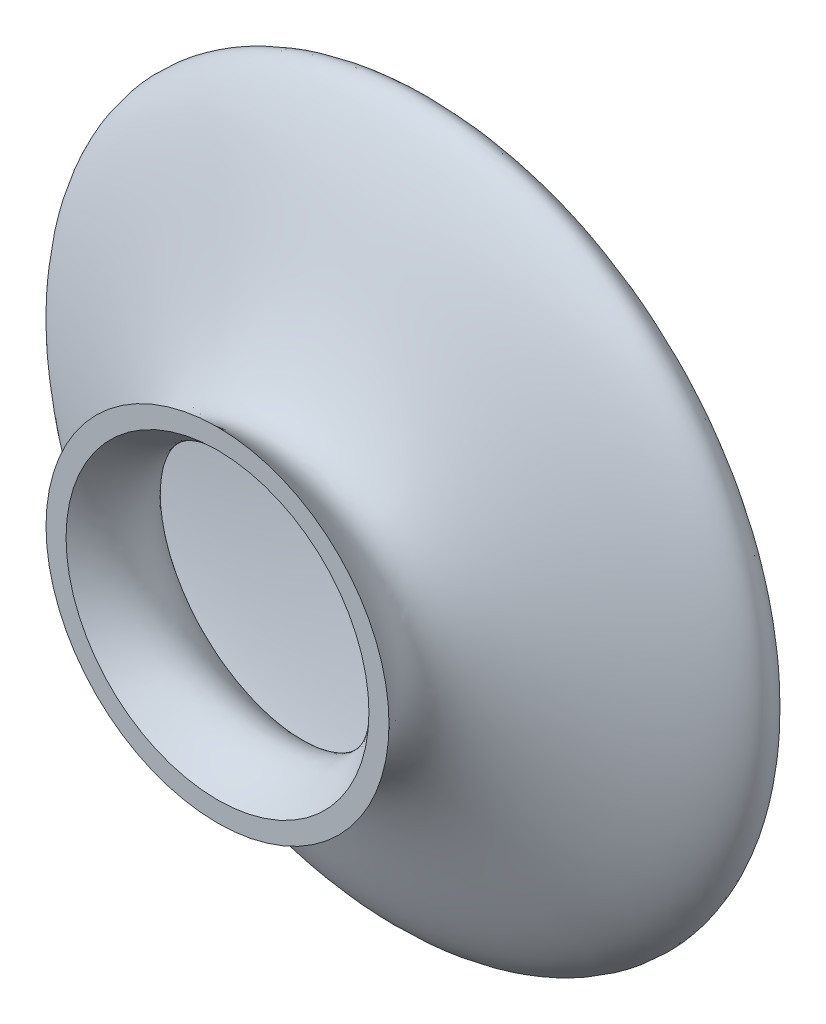
ISO-10303-21;
HEADER;
FILE_DESCRIPTION(('STEP AP214'),'2;1');
FILE_NAME('part.step','',(''),(''),'','','');
FILE_SCHEMA(('AUTOMOTIVE_DESIGN { 1 0 10303 214 1 1 1 1 }'));
ENDSEC;
DATA;
#1=APPLICATION_CONTEXT('core data for automotive mechanical design processes');
#2=APPLICATION_PROTOCOL_DEFINITION('international standard','automotive_design',2000,#1);
#3=PRODUCT_CONTEXT('',#1,'mechanical');
#4=PRODUCT('Part','Part','',(#3));
#5=PRODUCT_RELATED_PRODUCT_CATEGORY('part','',(#4));
#6=PRODUCT_DEFINITION_FORMATION('','',#4);
#7=PRODUCT_DEFINITION_CONTEXT('part definition',#1,'design');
#8=PRODUCT_DEFINITION('design','',#6,#7);
#9=PRODUCT_DEFINITION_SHAPE('','',#8);
#10=(LENGTH_UNIT() NAMED_UNIT(*) SI_UNIT(.MILLI.,.METRE.));
#11=(NAMED_UNIT(*) PLANE_ANGLE_UNIT() SI_UNIT($,.RADIAN.));
#12=(NAMED_UNIT(*) SI_UNIT($,.STERADIAN.) SOLID_ANGLE_UNIT());
#13=UNCERTAINTY_MEASURE_WITH_UNIT(LENGTH_MEASURE(1.E-05),#10,'distance_accuracy_value','');
#14=(GEOMETRIC_REPRESENTATION_CONTEXT(3) GLOBAL_UNCERTAINTY_ASSIGNED_CONTEXT((#13)) GLOBAL_UNIT_ASSIGNED_CONTEXT((#10,
#11,#12)) REPRESENTATION_CONTEXT('',''));
#15=CARTESIAN_POINT('',(0.,0.,0.));
#16=DIRECTION('',(0.,0.,1.));
#17=DIRECTION('',(1.,0.,0.));
#18=AXIS2_PLACEMENT_3D('',#15,#16,#17);
#19=CARTESIAN_POINT('',(0.,40.1749024461703,-127.));
#20=CARTESIAN_POINT('',(0.,41.4414019211106,-126.750604813559));
#21=CARTESIAN_POINT('',(0.,44.0461469543306,-126.236821262521));
#22=CARTESIAN_POINT('',(0.,50.6007651177522,-124.940007316391));
#23=CARTESIAN_POINT('',(0.,59.2534667352402,-123.208199153359));
#24=CARTESIAN_POINT('',(0.,69.549203917735,-121.107831932044));
#25=CARTESIAN_POINT('',(0.,81.2804931493034,-118.631164571267));
#26=CARTESIAN_POINT('',(0.,92.974339805805,-116.04372231612));
#27=CARTESIAN_POINT('',(0.,103.187830037622,-113.638494879811));
#28=CARTESIAN_POINT('',(0.,111.899086195115,-111.438757455287));
#29=CARTESIAN_POINT('',(0.,119.130970308662,-109.478566403329));
#30=CARTESIAN_POINT('',(0.,124.887113287129,-107.817607666161));
#31=CARTESIAN_POINT('',(0.,130.348260360398,-106.120426963924));
#32=CARTESIAN_POINT('',(0.,135.503413055523,-104.37536398544));
#33=CARTESIAN_POINT('',(0.,140.345698031985,-102.567404060437));
#34=CARTESIAN_POINT('',(0.,144.860961033631,-100.679411935521));
#35=CARTESIAN_POINT('',(0.,149.013238591044,-98.6725808415814));
#36=CARTESIAN_POINT('',(0.,152.35049949,-96.7316735182867));
#37=CARTESIAN_POINT('',(0.,154.873873341389,-94.9195395213734));
#38=CARTESIAN_POINT('',(0.,156.924745488784,-93.0877146772521));
#39=CARTESIAN_POINT('',(0.,158.295776639094,-91.4827635344511));
#40=CARTESIAN_POINT('',(0.,159.252299625908,-89.7732636786435));
#41=CARTESIAN_POINT('',(0.,159.736253810502,-87.8592681549841));
#42=CARTESIAN_POINT('',(0.,159.786660469074,-86.0844807006875));
#43=CARTESIAN_POINT('',(0.,159.235545279379,-84.100199392072));
#44=CARTESIAN_POINT('',(0.,158.070854838249,-82.1097331396155));
#45=CARTESIAN_POINT('',(0.,156.490016667143,-80.2218440880137));
#46=CARTESIAN_POINT('',(0.,154.695602783555,-78.5261683652711));
#47=CARTESIAN_POINT('',(0.,152.164404510104,-76.5037296586083));
#48=CARTESIAN_POINT('',(0.,149.385593587913,-74.6389666095655));
#49=CARTESIAN_POINT('',(0.,146.5166658544,-72.9185517352579));
#50=CARTESIAN_POINT('',(0.,143.584038254754,-71.3055334151804));
#51=CARTESIAN_POINT('',(0.,141.20822667765,-70.0653863891528));
#52=CARTESIAN_POINT('',(0.,138.210817827935,-68.5689572008392));
#53=CARTESIAN_POINT('',(0.,134.579838967493,-66.8433159167663));
#54=CARTESIAN_POINT('',(0.,130.308342210159,-64.9062203841946));
#55=CARTESIAN_POINT('',(0.,125.395635431771,-62.7625626108));
#56=CARTESIAN_POINT('',(0.,120.463919063654,-60.6631460210674));
#57=CARTESIAN_POINT('',(0.,115.522613748881,-58.5865110351406));
#58=CARTESIAN_POINT('',(0.,110.579691349829,-56.5137495892166));
#59=CARTESIAN_POINT('',(0.,105.642718006137,-54.4267763548241));
#60=CARTESIAN_POINT('',(0.,100.719657493353,-52.3071530829638));
#61=CARTESIAN_POINT('',(0.,95.8195855374675,-50.1345768514087));
#62=CARTESIAN_POINT('',(0.,91.090722367048,-47.9486064898861));
#63=CARTESIAN_POINT('',(0.,86.5438567318524,-45.7294453835949));
#64=CARTESIAN_POINT('',(0.,82.193101497207,-43.4557871452477));
#65=CARTESIAN_POINT('',(0.,78.0556726962069,-41.1032395462933));
#66=CARTESIAN_POINT('',(0.,74.0989263458421,-38.5916748028364));
#67=CARTESIAN_POINT('',(0.,70.3770107676925,-35.8605911601953));
#68=CARTESIAN_POINT('',(0.,67.357804950721,-33.1569889757805));
#69=CARTESIAN_POINT('',(0.,65.0655195392958,-30.5225820990703));
#70=CARTESIAN_POINT('',(0.,63.300806121086,-27.7355173102646));
#71=CARTESIAN_POINT('',(0.,62.2683351867874,-25.1919312821399));
#72=CARTESIAN_POINT('',(0.,61.8420741781314,-22.5472037978377));
#73=CARTESIAN_POINT('',(0.,62.0320574400823,-19.7008978775976));
#74=CARTESIAN_POINT('',(0.,62.733852077571,-17.0529703637298));
#75=CARTESIAN_POINT('',(0.,64.1002931291334,-14.087960980921));
#76=CARTESIAN_POINT('',(0.,65.8760803006642,-11.3675849536212));
#77=CARTESIAN_POINT('',(0.,67.5348624468086,-9.23724869416343));
#78=CARTESIAN_POINT('',(0.,68.9335408027901,-7.59534567279619));
#79=CARTESIAN_POINT('',(0.,69.8287383509904,-6.58761499282965));
#80=CARTESIAN_POINT('',(0.,70.5546454436049,-5.79172106884749));
#81=CARTESIAN_POINT('',(0.,71.2969783895233,-4.99678810992577));
#82=CARTESIAN_POINT('',(0.,72.0122796615693,-4.24342724512397));
#83=CARTESIAN_POINT('',(0.,73.0350535432262,-3.18812102771738));
#84=CARTESIAN_POINT('',(0.,73.9568237843356,-2.24660085762518));
#85=CARTESIAN_POINT('',(0.,75.2128453362792,-0.987154507986555));
#86=CARTESIAN_POINT('',(0.,75.8714966061481,-0.328503393851881));
#87=CARTESIAN_POINT('',(0.,76.2,0.));
#88=B_SPLINE_CURVE_WITH_KNOTS('',4,(#19,#20,#21,#22,#23,#24,#25,#26,#27,#28,#29,#30,#31,#32,#33,
#34,#35,#36,#37,#38,#39,#40,#41,#42,#43,#44,#45,#46,#47,#48,#49,#50,#51,#52,#53,#54,#55,#56,#57,
#58,#59,#60,#61,#62,#63,#64,#65,#66,#67,#68,#69,#70,#71,#72,#73,#74,#75,#76,#77,#78,#79,#80,#81,
#82,#83,#84,#85,#86,#87),.UNSPECIFIED.,.F.,.F.,(5,1,1,1,1,1,1,1,1,1,1,1,1,1,1,1,1,1,1,1,1,1,1,1,
1,1,1,1,1,1,1,1,1,1,1,1,1,1,1,1,1,1,1,1,1,1,1,1,1,1,1,1,1,1,1,1,1,1,1,1,1,1,1,1,1,5),
(0.0525184973487657,0.0711068419678162,0.089695186278309,0.126871874899295,0.164048560830599,
0.201225246761903,0.238401829003599,0.275578411245294,0.294166807736091,0.312755204226887,
0.331343600717684,0.349931997208481,0.365109531415269,0.380287065622058,0.395464599828847,
0.410642134035635,0.422295658794791,0.428122421174369,0.433949183553947,0.444703884713478,
0.448388470860726,0.452073057007974,0.458322057739313,0.466492156937834,0.473494477979164,
0.480496799020495,0.488788029452303,0.497079259884111,0.513661720747727,0.521975299177329,
0.530288877606931,0.538602456036533,0.546916034466136,0.56354319132534,0.580170348184545,
0.596797482731187,0.61342461727783,0.630051751824473,0.646678886371115,0.663306009269687,
0.679933132168259,0.696560255066831,0.713187377965402,0.727947045365148,0.742706712764894,
0.757466380164639,0.772226047564385,0.786074144301258,0.799922241038132,0.807657563480158,
0.815392885922184,0.82688942682555,0.833712834085969,0.840536241346388,0.850604486840262,
0.860672732334136,0.874052837811249,0.880742890549805,0.884087916919083,0.887432943288361,
0.890777969657639,0.894122996026917,0.897468022396195,0.900813048765474,0.90750310150403,
0.914193154083962),.UNSPECIFIED.);
#89=CARTESIAN_POINT('',(0.,0.,0.));
#90=DIRECTION('',(0.,0.,1.));
#91=AXIS1_PLACEMENT('',#89,#90);
#92=SURFACE_OF_REVOLUTION('',#88,#91);
#93=CARTESIAN_POINT('',(0.,0.,-3.1308124115056E-08));
#94=DIRECTION('',(0.,0.,1.));
#95=DIRECTION('',(1.,0.,0.));
#96=AXIS2_PLACEMENT_3D('',#93,#94,#95);
#97=CIRCLE('',#96,76.1999999687005);
#98=CARTESIAN_POINT('',(76.1999999687005,0.,-3.1308124115056E-08));
#99=VERTEX_POINT('',#98);
#100=EDGE_CURVE('E46',#99,#99,#97,.T.);
#101=ORIENTED_EDGE('',*,*,#100,.F.);
#102=EDGE_LOOP('',(#101));
#103=FACE_BOUND('',#102,.T.);
#104=CARTESIAN_POINT('',(0.,0.,-127.000000016471));
#105=DIRECTION('',(0.,0.,1.));
#106=DIRECTION('',(1.,0.,0.));
#107=AXIS2_PLACEMENT_3D('',#104,#105,#106);
#108=CIRCLE('',#107,40.1749023625642);
#109=CARTESIAN_POINT('',(40.1749023625642,0.,-127.000000016471));
#110=VERTEX_POINT('',#109);
#111=EDGE_CURVE('E10',#110,#110,#108,.T.);
#112=ORIENTED_EDGE('',*,*,#111,.T.);
#113=EDGE_LOOP('',(#112));
#114=FACE_BOUND('',#113,.T.);
#115=ADVANCED_FACE('F31',(#103,#114),#92,.T.);
#116=CARTESIAN_POINT('',(0.,40.1749023625642,-127.000000016471));
#117=DIRECTION('',(0.,0.,1.));
#118=DIRECTION('',(1.,0.,0.));
#119=AXIS2_PLACEMENT_3D('',#116,#117,#118);
#120=PLANE('',#119);
#121=ORIENTED_EDGE('',*,*,#111,.F.);
#122=EDGE_LOOP('',(#121));
#123=FACE_BOUND('',#122,.T.);
#124=ADVANCED_FACE('F69',(#123),#120,.F.);
#125=CARTESIAN_POINT('',(0.,0.,-120.650000016471));
#126=DIRECTION('',(0.,0.,-1.));
#127=DIRECTION('',(-1.,0.,0.));
#128=AXIS2_PLACEMENT_3D('',#125,#126,#127);
#129=PLANE('',#128);
#130=CARTESIAN_POINT('',(0.,0.,-120.650000016471));
#131=DIRECTION('',(0.,0.,1.));
#132=DIRECTION('',(1.,0.,0.));
#133=AXIS2_PLACEMENT_3D('',#130,#131,#132);
#134=CIRCLE('',#133,39.5554460308335);
#135=CARTESIAN_POINT('',(39.5554460308335,0.,-120.650000016471));
#136=VERTEX_POINT('',#135);
#137=EDGE_CURVE('E38',#136,#136,#134,.T.);
#138=ORIENTED_EDGE('',*,*,#137,.T.);
#139=EDGE_LOOP('',(#138));
#140=FACE_BOUND('',#139,.T.);
#141=ADVANCED_FACE('F66',(#140),#129,.F.);
#142=CARTESIAN_POINT('',(0.,71.7097747535021,4.49022575467291));
#143=CARTESIAN_POINT('',(0.,71.4769176633709,4.25736823948771));
#144=CARTESIAN_POINT('',(0.,71.0447832573985,3.82523640770746));
#145=CARTESIAN_POINT('',(0.,70.1961592454538,2.97448349377638));
#146=CARTESIAN_POINT('',(0.,69.3364881990118,2.108418787556));
#147=CARTESIAN_POINT('',(0.,68.6070638050732,1.36567177306058));
#148=CARTESIAN_POINT('',(0.,67.838423831716,0.575239132658954));
#149=CARTESIAN_POINT('',(0.,67.0157643405159,-0.281743091065477));
#150=CARTESIAN_POINT('',(0.,66.2522843983471,-1.09355363572556));
#151=CARTESIAN_POINT('',(0.,64.6678628079581,-2.81107130435183));
#152=CARTESIAN_POINT('',(0.,62.3394825373481,-5.4950240300861));
#153=CARTESIAN_POINT('',(0.,59.3590304243436,-9.58907636763875));
#154=CARTESIAN_POINT('',(0.,57.1931986431445,-13.6984913238251));
#155=CARTESIAN_POINT('',(0.,55.9989169949447,-17.5915167293423));
#156=CARTESIAN_POINT('',(0.,55.5314774512609,-20.7875487906119));
#157=CARTESIAN_POINT('',(0.,55.6371803805352,-24.1273417494033));
#158=CARTESIAN_POINT('',(0.,56.3381549535447,-27.3524362242169));
#159=CARTESIAN_POINT('',(0.,57.5212016086873,-30.2962350029345));
#160=CARTESIAN_POINT('',(0.,59.5136436036154,-33.741905317162));
#161=CARTESIAN_POINT('',(0.,62.4578436506755,-37.2577773968662));
#162=CARTESIAN_POINT('',(0.,66.2289346860371,-40.6520437185186));
#163=CARTESIAN_POINT('',(0.,70.1114749366929,-43.53848046858));
#164=CARTESIAN_POINT('',(0.,75.364359817392,-46.9344242482838));
#165=CARTESIAN_POINT('',(0.,82.0161093831014,-50.6011041385996));
#166=CARTESIAN_POINT('',(0.,90.0545074443972,-54.5050609817604));
#167=CARTESIAN_POINT('',(0.,98.1138689713101,-58.1127967152702));
#168=CARTESIAN_POINT('',(0.,106.166449912866,-61.5510560387231));
#169=CARTESIAN_POINT('',(0.,114.185941002086,-64.9093863875542));
#170=CARTESIAN_POINT('',(0.,122.139860174612,-68.2645089581365));
#171=CARTESIAN_POINT('',(0.,129.978724811153,-71.6945943461212));
#172=CARTESIAN_POINT('',(0.,136.345197942502,-74.6931464970477));
#173=CARTESIAN_POINT('',(0.,141.242736683481,-77.242236159347));
#174=CARTESIAN_POINT('',(0.,144.764800896792,-79.2500607960605));
#175=CARTESIAN_POINT('',(0.,148.050514765888,-81.3719371685038));
#176=CARTESIAN_POINT('',(0.,150.455720176051,-83.2480209160494));
#177=CARTESIAN_POINT('',(0.,151.976692166636,-84.7368919860751));
#178=CARTESIAN_POINT('',(0.,152.837714314807,-85.79505079999));
#179=CARTESIAN_POINT('',(0.,153.305258339695,-86.6320260640395));
#180=CARTESIAN_POINT('',(0.,153.384735663959,-87.0259349594076));
#181=CARTESIAN_POINT('',(0.,153.379149873959,-87.0117231503209));
#182=CARTESIAN_POINT('',(0.,153.312779081497,-87.3137716007877));
#183=CARTESIAN_POINT('',(0.,152.831411276414,-88.0814110856723));
#184=CARTESIAN_POINT('',(0.,151.938424194422,-89.0372156000575));
#185=CARTESIAN_POINT('',(0.,150.740829055903,-90.0516631599839));
#186=CARTESIAN_POINT('',(0.,148.865336878268,-91.3855862127814));
#187=CARTESIAN_POINT('',(0.,146.150839274048,-92.9741651049789));
#188=CARTESIAN_POINT('',(0.,142.592517245333,-94.7115599770358));
#189=CARTESIAN_POINT('',(0.,138.847565996803,-96.3114389430272));
#190=CARTESIAN_POINT('',(0.,134.984719058225,-97.7954635000594));
#191=CARTESIAN_POINT('',(0.,129.723472107323,-99.6486604842105));
#192=CARTESIAN_POINT('',(0.,123.000904008048,-101.770534647975));
#193=CARTESIAN_POINT('',(0.,114.80008160874,-104.096695108775));
#194=CARTESIAN_POINT('',(0.,106.511697420715,-106.259436898528));
#195=CARTESIAN_POINT('',(0.,98.1639381912166,-108.297556530454));
#196=CARTESIAN_POINT('',(0.,86.9729214366075,-110.886520391629));
#197=CARTESIAN_POINT('',(0.,75.7289843831271,-113.322659212182));
#198=CARTESIAN_POINT('',(0.,65.834301805178,-115.378397463385));
#199=CARTESIAN_POINT('',(0.,60.1932611595455,-116.531096036484));
#200=CARTESIAN_POINT('',(0.,55.9786069836483,-117.384091243864));
#201=CARTESIAN_POINT('',(0.,51.7384231494427,-118.234985278067));
#202=CARTESIAN_POINT('',(0.,48.0524291144586,-118.969133995894));
#203=CARTESIAN_POINT('',(0.,45.030032243443,-119.568523426799));
#204=CARTESIAN_POINT('',(0.,42.8345477619798,-120.002946223084));
#205=CARTESIAN_POINT('',(0.,40.7943851884519,-120.405840763487));
#206=CARTESIAN_POINT('',(0.,39.5752597010685,-120.646134953489));
#207=CARTESIAN_POINT('',(0.,38.9480398040299,-120.76964576371));
#208=B_SPLINE_CURVE_WITH_KNOTS('',3,(#142,#143,#144,#145,#146,#147,#148,#149,#150,#151,#152,
#153,#154,#155,#156,#157,#158,#159,#160,#161,#162,#163,#164,#165,#166,#167,#168,#169,#170,#171,
#172,#173,#174,#175,#176,#177,#178,#179,#180,#181,#182,#183,#184,#185,#186,#187,#188,#189,#190,
#191,#192,#193,#194,#195,#196,#197,#198,#199,#200,#201,#202,#203,#204,#205,#206,#207),
.UNSPECIFIED.,.F.,.F.,(4,1,1,1,1,1,1,1,1,1,1,1,1,1,1,1,1,1,1,1,1,1,1,1,1,1,1,1,1,1,1,1,1,1,1,1,
1,1,1,1,1,1,1,1,1,1,1,1,1,1,1,1,1,1,1,1,1,1,1,1,1,1,1,4),(0.0525184971711001,0.0558844137983301,
0.0592503304255601,0.0626162470527901,0.0659821636800202,0.0693480803072502,0.0727139969344803,
0.0760799135617103,0.0794458301889403,0.0929094966978605,0.106373163206781,0.119836829715701,
0.126568662970161,0.133300496224621,0.140032329479081,0.146764162733541,0.153495995988001,
0.160227829242461,0.173691495751381,0.187155162260301,0.200618828769222,0.214082495278142,
0.241009828295982,0.267937161313822,0.294864494331663,0.321791827349503,0.348719160367343,
0.375646493385183,0.402573826403024,0.429501159420864,0.442964825929784,0.456428492438704,
0.469892158947624,0.483355825456544,0.490087658711004,0.496819491965464,0.503551325219925,
0.510283158474385,0.517014991728845,0.523746824983305,0.530478658237765,0.537210491492225,
0.543942324746685,0.550674158001145,0.564137824510065,0.577601491018985,0.591065157527905,
0.604528824036826,0.617992490545746,0.644919823563586,0.671847156581426,0.698774489599267,
0.725701822617107,0.752629155634947,0.806483821670628,0.833411154688468,0.846874821197388,
0.860338487706308,0.873802154215228,0.887265820724148,0.893997653978609,0.900729487233069,
0.907461320487529,0.914193153741989),.UNSPECIFIED.);
#209=CARTESIAN_POINT('',(0.,0.,0.));
#210=DIRECTION('',(0.,0.,1.));
#211=AXIS1_PLACEMENT('',#209,#210);
#212=SURFACE_OF_REVOLUTION('',#208,#211);
#213=ORIENTED_EDGE('',*,*,#137,.F.);
#214=EDGE_LOOP('',(#213));
#215=FACE_BOUND('',#214,.T.);
#216=CARTESIAN_POINT('',(0.,0.,0.));
#217=DIRECTION('',(0.,0.,1.));
#218=DIRECTION('',(1.,0.,0.));
#219=AXIS2_PLACEMENT_3D('',#216,#217,#218);
#220=CIRCLE('',#219,67.2870859144023);
#221=CARTESIAN_POINT('',(67.2870859144023,0.,0.));
#222=VERTEX_POINT('',#221);
#223=EDGE_CURVE('E42',#222,#222,#220,.T.);
#224=ORIENTED_EDGE('',*,*,#223,.T.);
#225=EDGE_LOOP('',(#224));
#226=FACE_BOUND('',#225,.T.);
#227=ADVANCED_FACE('F61',(#215,#226),#212,.T.);
#228=CARTESIAN_POINT('',(0.,76.1999999687005,-1.56540382050802E-08));
#229=DIRECTION('',(0.,0.,-1.));
#230=DIRECTION('',(-1.,0.,0.));
#231=AXIS2_PLACEMENT_3D('',#228,#229,#230);
#232=PLANE('',#231);
#233=ORIENTED_EDGE('',*,*,#223,.F.);
#234=EDGE_LOOP('',(#233));
#235=FACE_BOUND('',#234,.T.);
#236=ORIENTED_EDGE('',*,*,#100,.T.);
#237=EDGE_LOOP('',(#236));
#238=FACE_BOUND('',#237,.T.);
#239=ADVANCED_FACE('F65',(#235,#238),#232,.F.);
#240=CLOSED_SHELL('',(#115,#124,#141,#227,#239));
#241=MANIFOLD_SOLID_BREP('B2',#240);
#242=ADVANCED_BREP_SHAPE_REPRESENTATION('',(#18,#241),#14);
#243=SHAPE_DEFINITION_REPRESENTATION(#9,#242);
ENDSEC;
END-ISO-10303-21;
